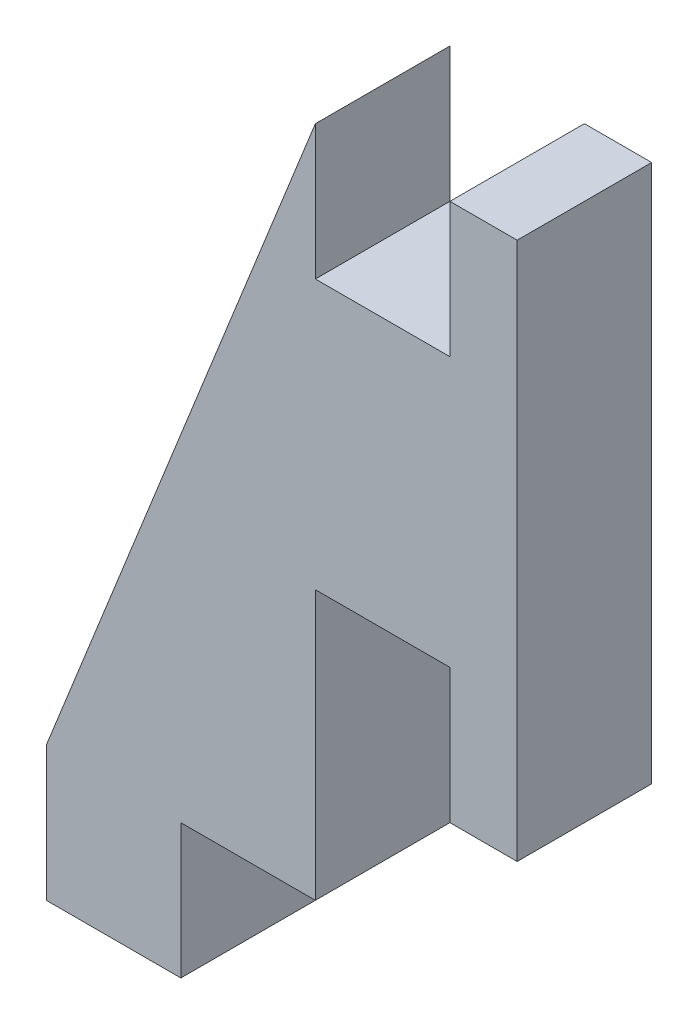
ISO-10303-21;
HEADER;
FILE_DESCRIPTION(('STEP AP214'),'2;1');
FILE_NAME('part.step','',(''),(''),'','','');
FILE_SCHEMA(('AUTOMOTIVE_DESIGN { 1 0 10303 214 1 1 1 1 }'));
ENDSEC;
DATA;
#1=APPLICATION_CONTEXT('core data for automotive mechanical design processes');
#2=APPLICATION_PROTOCOL_DEFINITION('international standard','automotive_design',2000,#1);
#3=PRODUCT_CONTEXT('',#1,'mechanical');
#4=PRODUCT('Part','Part','',(#3));
#5=PRODUCT_RELATED_PRODUCT_CATEGORY('part','',(#4));
#6=PRODUCT_DEFINITION_FORMATION('','',#4);
#7=PRODUCT_DEFINITION_CONTEXT('part definition',#1,'design');
#8=PRODUCT_DEFINITION('design','',#6,#7);
#9=PRODUCT_DEFINITION_SHAPE('','',#8);
#10=(LENGTH_UNIT() NAMED_UNIT(*) SI_UNIT(.MILLI.,.METRE.));
#11=(NAMED_UNIT(*) PLANE_ANGLE_UNIT() SI_UNIT($,.RADIAN.));
#12=(NAMED_UNIT(*) SI_UNIT($,.STERADIAN.) SOLID_ANGLE_UNIT());
#13=UNCERTAINTY_MEASURE_WITH_UNIT(LENGTH_MEASURE(1.E-05),#10,'distance_accuracy_value','');
#14=(GEOMETRIC_REPRESENTATION_CONTEXT(3) GLOBAL_UNCERTAINTY_ASSIGNED_CONTEXT((#13)) GLOBAL_UNIT_ASSIGNED_CONTEXT((#10,
#11,#12)) REPRESENTATION_CONTEXT('',''));
#15=CARTESIAN_POINT('',(0.,0.,0.));
#16=DIRECTION('',(0.,0.,1.));
#17=DIRECTION('',(1.,0.,0.));
#18=AXIS2_PLACEMENT_3D('',#15,#16,#17);
#19=CARTESIAN_POINT('',(0.,25.4,6.35));
#20=DIRECTION('',(-1.,0.,0.));
#21=DIRECTION('',(0.,0.,1.));
#22=AXIS2_PLACEMENT_3D('',#19,#20,#21);
#23=PLANE('',#22);
#24=DIRECTION('',(0.,1.,0.));
#25=VECTOR('',#24,1.);
#26=CARTESIAN_POINT('',(0.,25.4,0.));
#27=LINE('',#26,#25);
#28=CARTESIAN_POINT('',(0.,25.4,0.));
#29=VERTEX_POINT('',#28);
#30=CARTESIAN_POINT('',(0.,31.75,0.));
#31=VERTEX_POINT('',#30);
#32=EDGE_CURVE('E177',#29,#31,#27,.T.);
#33=ORIENTED_EDGE('',*,*,#32,.T.);
#34=DIRECTION('',(0.,0.,-1.));
#35=VECTOR('',#34,1.);
#36=CARTESIAN_POINT('',(0.,31.75,6.35));
#37=LINE('',#36,#35);
#38=CARTESIAN_POINT('',(0.,31.75,6.35));
#39=VERTEX_POINT('',#38);
#40=EDGE_CURVE('E11',#39,#31,#37,.T.);
#41=ORIENTED_EDGE('',*,*,#40,.F.);
#42=DIRECTION('',(0.,1.,0.));
#43=VECTOR('',#42,1.);
#44=CARTESIAN_POINT('',(0.,25.4,6.35));
#45=LINE('',#44,#43);
#46=CARTESIAN_POINT('',(0.,25.4,6.35));
#47=VERTEX_POINT('',#46);
#48=EDGE_CURVE('E178',#47,#39,#45,.T.);
#49=ORIENTED_EDGE('',*,*,#48,.F.);
#50=DIRECTION('',(0.,0.,-1.));
#51=VECTOR('',#50,1.);
#52=CARTESIAN_POINT('',(0.,25.4,6.35));
#53=LINE('',#52,#51);
#54=EDGE_CURVE('E191',#47,#29,#53,.T.);
#55=ORIENTED_EDGE('',*,*,#54,.T.);
#56=EDGE_LOOP('',(#33,#41,#49,#55));
#57=FACE_BOUND('',#56,.T.);
#58=ADVANCED_FACE('F33',(#57),#23,.F.);
#59=CARTESIAN_POINT('',(-12.7,0.,6.35));
#60=DIRECTION('',(0.928476690885259,-0.371390676354104,0.));
#61=DIRECTION('',(0.371390676354104,0.928476690885259,0.));
#62=AXIS2_PLACEMENT_3D('',#59,#60,#61);
#63=PLANE('',#62);
#64=DIRECTION('',(-0.371390676354104,-0.928476690885259,0.));
#65=VECTOR('',#64,1.);
#66=CARTESIAN_POINT('',(-12.7,0.,0.));
#67=LINE('',#66,#65);
#68=CARTESIAN_POINT('',(-12.7,0.,0.));
#69=VERTEX_POINT('',#68);
#70=EDGE_CURVE('E194',#31,#69,#67,.T.);
#71=ORIENTED_EDGE('',*,*,#70,.T.);
#72=DIRECTION('',(0.,0.,-1.));
#73=VECTOR('',#72,1.);
#74=CARTESIAN_POINT('',(-12.7,0.,6.35));
#75=LINE('',#74,#73);
#76=CARTESIAN_POINT('',(-12.7,0.,6.35));
#77=VERTEX_POINT('',#76);
#78=EDGE_CURVE('E41',#77,#69,#75,.T.);
#79=ORIENTED_EDGE('',*,*,#78,.F.);
#80=DIRECTION('',(-0.371390676354104,-0.928476690885259,0.));
#81=VECTOR('',#80,1.);
#82=CARTESIAN_POINT('',(-12.7,0.,6.35));
#83=LINE('',#82,#81);
#84=EDGE_CURVE('E92',#39,#77,#83,.T.);
#85=ORIENTED_EDGE('',*,*,#84,.F.);
#86=ORIENTED_EDGE('',*,*,#40,.T.);
#87=EDGE_LOOP('',(#71,#79,#85,#86));
#88=FACE_BOUND('',#87,.T.);
#89=ADVANCED_FACE('F247',(#88),#63,.F.);
#90=CARTESIAN_POINT('',(-12.7,-6.35,6.35));
#91=DIRECTION('',(1.,0.,0.));
#92=DIRECTION('',(0.,0.,-1.));
#93=AXIS2_PLACEMENT_3D('',#90,#91,#92);
#94=PLANE('',#93);
#95=DIRECTION('',(0.,-1.,0.));
#96=VECTOR('',#95,1.);
#97=CARTESIAN_POINT('',(-12.7,-6.35,0.));
#98=LINE('',#97,#96);
#99=CARTESIAN_POINT('',(-12.7,-6.35,0.));
#100=VERTEX_POINT('',#99);
#101=EDGE_CURVE('E196',#69,#100,#98,.T.);
#102=ORIENTED_EDGE('',*,*,#101,.T.);
#103=DIRECTION('',(0.,0.,-1.));
#104=VECTOR('',#103,1.);
#105=CARTESIAN_POINT('',(-12.7,-6.35,6.35));
#106=LINE('',#105,#104);
#107=CARTESIAN_POINT('',(-12.7,-6.35,6.35));
#108=VERTEX_POINT('',#107);
#109=EDGE_CURVE('E220',#108,#100,#106,.T.);
#110=ORIENTED_EDGE('',*,*,#109,.F.);
#111=DIRECTION('',(0.,-1.,0.));
#112=VECTOR('',#111,1.);
#113=CARTESIAN_POINT('',(-12.7,-6.35,6.35));
#114=LINE('',#113,#112);
#115=EDGE_CURVE('E181',#77,#108,#114,.T.);
#116=ORIENTED_EDGE('',*,*,#115,.F.);
#117=ORIENTED_EDGE('',*,*,#78,.T.);
#118=EDGE_LOOP('',(#102,#110,#116,#117));
#119=FACE_BOUND('',#118,.T.);
#120=ADVANCED_FACE('F226',(#119),#94,.F.);
#121=CARTESIAN_POINT('',(-6.35,-6.35,6.35));
#122=DIRECTION('',(0.,1.,0.));
#123=DIRECTION('',(-1.,0.,0.));
#124=AXIS2_PLACEMENT_3D('',#121,#122,#123);
#125=PLANE('',#124);
#126=DIRECTION('',(1.,0.,0.));
#127=VECTOR('',#126,1.);
#128=CARTESIAN_POINT('',(-6.35,-6.35,0.));
#129=LINE('',#128,#127);
#130=CARTESIAN_POINT('',(-6.35,-6.35,0.));
#131=VERTEX_POINT('',#130);
#132=EDGE_CURVE('E198',#100,#131,#129,.T.);
#133=ORIENTED_EDGE('',*,*,#132,.T.);
#134=DIRECTION('',(0.,0.,-1.));
#135=VECTOR('',#134,1.);
#136=CARTESIAN_POINT('',(-6.35,-6.35,6.35));
#137=LINE('',#136,#135);
#138=CARTESIAN_POINT('',(-6.35,-6.35,6.35));
#139=VERTEX_POINT('',#138);
#140=EDGE_CURVE('E217',#139,#131,#137,.T.);
#141=ORIENTED_EDGE('',*,*,#140,.F.);
#142=DIRECTION('',(1.,0.,0.));
#143=VECTOR('',#142,1.);
#144=CARTESIAN_POINT('',(-6.35,-6.35,6.35));
#145=LINE('',#144,#143);
#146=EDGE_CURVE('E183',#108,#139,#145,.T.);
#147=ORIENTED_EDGE('',*,*,#146,.F.);
#148=ORIENTED_EDGE('',*,*,#109,.T.);
#149=EDGE_LOOP('',(#133,#141,#147,#148));
#150=FACE_BOUND('',#149,.T.);
#151=ADVANCED_FACE('F236',(#150),#125,.F.);
#152=CARTESIAN_POINT('',(-6.35,0.,6.35));
#153=DIRECTION('',(-1.,0.,0.));
#154=DIRECTION('',(0.,0.,1.));
#155=AXIS2_PLACEMENT_3D('',#152,#153,#154);
#156=PLANE('',#155);
#157=DIRECTION('',(0.,1.,0.));
#158=VECTOR('',#157,1.);
#159=CARTESIAN_POINT('',(-6.35,0.,0.));
#160=LINE('',#159,#158);
#161=CARTESIAN_POINT('',(-6.35,0.,0.));
#162=VERTEX_POINT('',#161);
#163=EDGE_CURVE('E200',#131,#162,#160,.T.);
#164=ORIENTED_EDGE('',*,*,#163,.T.);
#165=DIRECTION('',(0.,0.,-1.));
#166=VECTOR('',#165,1.);
#167=CARTESIAN_POINT('',(-6.35,0.,6.35));
#168=LINE('',#167,#166);
#169=CARTESIAN_POINT('',(-6.35,0.,6.35));
#170=VERTEX_POINT('',#169);
#171=EDGE_CURVE('E214',#170,#162,#168,.T.);
#172=ORIENTED_EDGE('',*,*,#171,.F.);
#173=DIRECTION('',(0.,1.,0.));
#174=VECTOR('',#173,1.);
#175=CARTESIAN_POINT('',(-6.35,0.,6.35));
#176=LINE('',#175,#174);
#177=EDGE_CURVE('E185',#139,#170,#176,.T.);
#178=ORIENTED_EDGE('',*,*,#177,.F.);
#179=ORIENTED_EDGE('',*,*,#140,.T.);
#180=EDGE_LOOP('',(#164,#172,#178,#179));
#181=FACE_BOUND('',#180,.T.);
#182=ADVANCED_FACE('F240',(#181),#156,.F.);
#183=CARTESIAN_POINT('',(0.,0.,6.35));
#184=DIRECTION('',(0.,1.,0.));
#185=DIRECTION('',(-1.,0.,0.));
#186=AXIS2_PLACEMENT_3D('',#183,#184,#185);
#187=PLANE('',#186);
#188=DIRECTION('',(1.,0.,0.));
#189=VECTOR('',#188,1.);
#190=CARTESIAN_POINT('',(0.,0.,0.));
#191=LINE('',#190,#189);
#192=CARTESIAN_POINT('',(0.,0.,0.));
#193=VERTEX_POINT('',#192);
#194=EDGE_CURVE('E202',#162,#193,#191,.T.);
#195=ORIENTED_EDGE('',*,*,#194,.T.);
#196=DIRECTION('',(0.,0.,-1.));
#197=VECTOR('',#196,1.);
#198=CARTESIAN_POINT('',(0.,0.,6.35));
#199=LINE('',#198,#197);
#200=CARTESIAN_POINT('',(0.,0.,6.35));
#201=VERTEX_POINT('',#200);
#202=EDGE_CURVE('E211',#201,#193,#199,.T.);
#203=ORIENTED_EDGE('',*,*,#202,.F.);
#204=DIRECTION('',(1.,0.,0.));
#205=VECTOR('',#204,1.);
#206=CARTESIAN_POINT('',(0.,0.,6.35));
#207=LINE('',#206,#205);
#208=EDGE_CURVE('E187',#170,#201,#207,.T.);
#209=ORIENTED_EDGE('',*,*,#208,.F.);
#210=ORIENTED_EDGE('',*,*,#171,.T.);
#211=EDGE_LOOP('',(#195,#203,#209,#210));
#212=FACE_BOUND('',#211,.T.);
#213=ADVANCED_FACE('F259',(#212),#187,.F.);
#214=CARTESIAN_POINT('',(0.,0.,6.35));
#215=DIRECTION('',(-1.,0.,0.));
#216=DIRECTION('',(0.,0.,1.));
#217=AXIS2_PLACEMENT_3D('',#214,#215,#216);
#218=PLANE('',#217);
#219=DIRECTION('',(0.,1.,0.));
#220=VECTOR('',#219,1.);
#221=CARTESIAN_POINT('',(0.,0.,0.));
#222=LINE('',#221,#220);
#223=CARTESIAN_POINT('',(0.,12.7,0.));
#224=VERTEX_POINT('',#223);
#225=EDGE_CURVE('E204',#193,#224,#222,.T.);
#226=ORIENTED_EDGE('',*,*,#225,.T.);
#227=DIRECTION('',(0.,0.,-1.));
#228=VECTOR('',#227,1.);
#229=CARTESIAN_POINT('',(0.,12.7,6.35));
#230=LINE('',#229,#228);
#231=CARTESIAN_POINT('',(0.,12.7,6.35));
#232=VERTEX_POINT('',#231);
#233=EDGE_CURVE('E137',#232,#224,#230,.T.);
#234=ORIENTED_EDGE('',*,*,#233,.F.);
#235=DIRECTION('',(0.,1.,0.));
#236=VECTOR('',#235,1.);
#237=CARTESIAN_POINT('',(0.,0.,6.35));
#238=LINE('',#237,#236);
#239=EDGE_CURVE('E123',#201,#232,#238,.T.);
#240=ORIENTED_EDGE('',*,*,#239,.F.);
#241=ORIENTED_EDGE('',*,*,#202,.T.);
#242=EDGE_LOOP('',(#226,#234,#240,#241));
#243=FACE_BOUND('',#242,.T.);
#244=ADVANCED_FACE('F262',(#243),#218,.F.);
#245=CARTESIAN_POINT('',(0.,12.7,6.35));
#246=DIRECTION('',(0.,1.,0.));
#247=DIRECTION('',(0.,0.,1.));
#248=AXIS2_PLACEMENT_3D('',#245,#246,#247);
#249=PLANE('',#248);
#250=DIRECTION('',(1.,0.,0.));
#251=VECTOR('',#250,1.);
#252=CARTESIAN_POINT('',(0.,12.7,0.));
#253=LINE('',#252,#251);
#254=CARTESIAN_POINT('',(6.35,12.7,0.));
#255=VERTEX_POINT('',#254);
#256=EDGE_CURVE('E133',#224,#255,#253,.T.);
#257=ORIENTED_EDGE('',*,*,#256,.T.);
#258=DIRECTION('',(0.,0.,-1.));
#259=VECTOR('',#258,1.);
#260=CARTESIAN_POINT('',(6.35,12.7,6.35));
#261=LINE('',#260,#259);
#262=CARTESIAN_POINT('',(6.35,12.7,6.35));
#263=VERTEX_POINT('',#262);
#264=EDGE_CURVE('E130',#263,#255,#261,.T.);
#265=ORIENTED_EDGE('',*,*,#264,.F.);
#266=DIRECTION('',(1.,0.,0.));
#267=VECTOR('',#266,1.);
#268=CARTESIAN_POINT('',(0.,12.7,6.35));
#269=LINE('',#268,#267);
#270=EDGE_CURVE('E114',#232,#263,#269,.T.);
#271=ORIENTED_EDGE('',*,*,#270,.F.);
#272=ORIENTED_EDGE('',*,*,#233,.T.);
#273=EDGE_LOOP('',(#257,#265,#271,#272));
#274=FACE_BOUND('',#273,.T.);
#275=ADVANCED_FACE('F131',(#274),#249,.F.);
#276=CARTESIAN_POINT('',(6.35,25.4,6.35));
#277=DIRECTION('',(0.,-1.,0.));
#278=DIRECTION('',(0.,0.,-1.));
#279=AXIS2_PLACEMENT_3D('',#276,#277,#278);
#280=PLANE('',#279);
#281=DIRECTION('',(-1.,0.,0.));
#282=VECTOR('',#281,1.);
#283=CARTESIAN_POINT('',(6.35,25.4,0.));
#284=LINE('',#283,#282);
#285=CARTESIAN_POINT('',(6.35,25.4,0.));
#286=VERTEX_POINT('',#285);
#287=EDGE_CURVE('E84',#286,#29,#284,.T.);
#288=ORIENTED_EDGE('',*,*,#287,.T.);
#289=ORIENTED_EDGE('',*,*,#54,.F.);
#290=DIRECTION('',(-1.,0.,0.));
#291=VECTOR('',#290,1.);
#292=CARTESIAN_POINT('',(6.35,25.4,6.35));
#293=LINE('',#292,#291);
#294=CARTESIAN_POINT('',(6.35,25.4,6.35));
#295=VERTEX_POINT('',#294);
#296=EDGE_CURVE('E49',#295,#47,#293,.T.);
#297=ORIENTED_EDGE('',*,*,#296,.F.);
#298=DIRECTION('',(0.,0.,-1.));
#299=VECTOR('',#298,1.);
#300=CARTESIAN_POINT('',(6.35,25.4,6.35));
#301=LINE('',#300,#299);
#302=EDGE_CURVE('E81',#295,#286,#301,.T.);
#303=ORIENTED_EDGE('',*,*,#302,.T.);
#304=EDGE_LOOP('',(#288,#289,#297,#303));
#305=FACE_BOUND('',#304,.T.);
#306=ADVANCED_FACE('F269',(#305),#280,.F.);
#307=CARTESIAN_POINT('',(0.,0.,6.35));
#308=DIRECTION('',(0.,0.,1.));
#309=DIRECTION('',(1.,0.,0.));
#310=AXIS2_PLACEMENT_3D('',#307,#308,#309);
#311=PLANE('',#310);
#312=ORIENTED_EDGE('',*,*,#48,.T.);
#313=ORIENTED_EDGE('',*,*,#84,.T.);
#314=ORIENTED_EDGE('',*,*,#115,.T.);
#315=ORIENTED_EDGE('',*,*,#146,.T.);
#316=ORIENTED_EDGE('',*,*,#177,.T.);
#317=ORIENTED_EDGE('',*,*,#208,.T.);
#318=ORIENTED_EDGE('',*,*,#239,.T.);
#319=ORIENTED_EDGE('',*,*,#270,.T.);
#320=DIRECTION('',(0.,-1.,0.));
#321=VECTOR('',#320,1.);
#322=CARTESIAN_POINT('',(6.35,6.35,6.35));
#323=LINE('',#322,#321);
#324=CARTESIAN_POINT('',(6.35,6.35,6.35));
#325=VERTEX_POINT('',#324);
#326=EDGE_CURVE('E120',#263,#325,#323,.T.);
#327=ORIENTED_EDGE('',*,*,#326,.T.);
#328=DIRECTION('',(1.,0.,0.));
#329=VECTOR('',#328,1.);
#330=CARTESIAN_POINT('',(9.525,6.35,6.35));
#331=LINE('',#330,#329);
#332=CARTESIAN_POINT('',(9.525,6.35,6.35));
#333=VERTEX_POINT('',#332);
#334=EDGE_CURVE('E146',#325,#333,#331,.T.);
#335=ORIENTED_EDGE('',*,*,#334,.T.);
#336=DIRECTION('',(0.,1.,0.));
#337=VECTOR('',#336,1.);
#338=CARTESIAN_POINT('',(9.525,6.35,6.35));
#339=LINE('',#338,#337);
#340=CARTESIAN_POINT('',(9.525,31.75,6.35));
#341=VERTEX_POINT('',#340);
#342=EDGE_CURVE('E152',#333,#341,#339,.T.);
#343=ORIENTED_EDGE('',*,*,#342,.T.);
#344=DIRECTION('',(-1.,0.,0.));
#345=VECTOR('',#344,1.);
#346=CARTESIAN_POINT('',(9.525,31.75,6.35));
#347=LINE('',#346,#345);
#348=CARTESIAN_POINT('',(6.35,31.75,6.35));
#349=VERTEX_POINT('',#348);
#350=EDGE_CURVE('E155',#341,#349,#347,.T.);
#351=ORIENTED_EDGE('',*,*,#350,.T.);
#352=EDGE_CURVE('E143',#349,#295,#323,.T.);
#353=ORIENTED_EDGE('',*,*,#352,.T.);
#354=ORIENTED_EDGE('',*,*,#296,.T.);
#355=EDGE_LOOP('',(#312,#313,#314,#315,#316,#317,#318,#319,#327,#335,#343,#351,#353,#354));
#356=FACE_BOUND('',#355,.T.);
#357=ADVANCED_FACE('F116',(#356),#311,.T.);
#358=CARTESIAN_POINT('',(0.,0.,0.));
#359=DIRECTION('',(0.,0.,1.));
#360=DIRECTION('',(1.,0.,0.));
#361=AXIS2_PLACEMENT_3D('',#358,#359,#360);
#362=PLANE('',#361);
#363=ORIENTED_EDGE('',*,*,#32,.F.);
#364=ORIENTED_EDGE('',*,*,#287,.F.);
#365=DIRECTION('',(0.,-1.,0.));
#366=VECTOR('',#365,1.);
#367=CARTESIAN_POINT('',(6.35,6.35,0.));
#368=LINE('',#367,#366);
#369=CARTESIAN_POINT('',(6.35,31.75,0.));
#370=VERTEX_POINT('',#369);
#371=EDGE_CURVE('E159',#370,#286,#368,.T.);
#372=ORIENTED_EDGE('',*,*,#371,.F.);
#373=DIRECTION('',(-1.,0.,0.));
#374=VECTOR('',#373,1.);
#375=CARTESIAN_POINT('',(9.525,31.75,0.));
#376=LINE('',#375,#374);
#377=CARTESIAN_POINT('',(9.525,31.75,0.));
#378=VERTEX_POINT('',#377);
#379=EDGE_CURVE('E144',#378,#370,#376,.T.);
#380=ORIENTED_EDGE('',*,*,#379,.F.);
#381=DIRECTION('',(0.,1.,0.));
#382=VECTOR('',#381,1.);
#383=CARTESIAN_POINT('',(9.525,6.35,0.));
#384=LINE('',#383,#382);
#385=CARTESIAN_POINT('',(9.525,6.35,0.));
#386=VERTEX_POINT('',#385);
#387=EDGE_CURVE('E148',#386,#378,#384,.T.);
#388=ORIENTED_EDGE('',*,*,#387,.F.);
#389=DIRECTION('',(1.,0.,0.));
#390=VECTOR('',#389,1.);
#391=CARTESIAN_POINT('',(9.525,6.35,0.));
#392=LINE('',#391,#390);
#393=CARTESIAN_POINT('',(6.35,6.35,0.));
#394=VERTEX_POINT('',#393);
#395=EDGE_CURVE('E162',#394,#386,#392,.T.);
#396=ORIENTED_EDGE('',*,*,#395,.F.);
#397=EDGE_CURVE('E163',#255,#394,#368,.T.);
#398=ORIENTED_EDGE('',*,*,#397,.F.);
#399=ORIENTED_EDGE('',*,*,#256,.F.);
#400=ORIENTED_EDGE('',*,*,#225,.F.);
#401=ORIENTED_EDGE('',*,*,#194,.F.);
#402=ORIENTED_EDGE('',*,*,#163,.F.);
#403=ORIENTED_EDGE('',*,*,#132,.F.);
#404=ORIENTED_EDGE('',*,*,#101,.F.);
#405=ORIENTED_EDGE('',*,*,#70,.F.);
#406=EDGE_LOOP('',(#363,#364,#372,#380,#388,#396,#398,#399,#400,#401,#402,#403,#404,#405));
#407=FACE_BOUND('',#406,.T.);
#408=ADVANCED_FACE('F231',(#407),#362,.F.);
#409=CARTESIAN_POINT('',(6.35,6.35,6.35));
#410=DIRECTION('',(1.,0.,0.));
#411=DIRECTION('',(0.,1.,0.));
#412=AXIS2_PLACEMENT_3D('',#409,#410,#411);
#413=PLANE('',#412);
#414=ORIENTED_EDGE('',*,*,#326,.F.);
#415=ORIENTED_EDGE('',*,*,#264,.T.);
#416=ORIENTED_EDGE('',*,*,#397,.T.);
#417=DIRECTION('',(0.,0.,-1.));
#418=VECTOR('',#417,1.);
#419=CARTESIAN_POINT('',(6.35,6.35,6.35));
#420=LINE('',#419,#418);
#421=EDGE_CURVE('E142',#325,#394,#420,.T.);
#422=ORIENTED_EDGE('',*,*,#421,.F.);
#423=EDGE_LOOP('',(#414,#415,#416,#422));
#424=FACE_BOUND('',#423,.T.);
#425=ADVANCED_FACE('F140',(#424),#413,.F.);
#426=ORIENTED_EDGE('',*,*,#302,.F.);
#427=ORIENTED_EDGE('',*,*,#352,.F.);
#428=DIRECTION('',(0.,0.,-1.));
#429=VECTOR('',#428,1.);
#430=CARTESIAN_POINT('',(6.35,31.75,6.35));
#431=LINE('',#430,#429);
#432=EDGE_CURVE('E158',#349,#370,#431,.T.);
#433=ORIENTED_EDGE('',*,*,#432,.T.);
#434=ORIENTED_EDGE('',*,*,#371,.T.);
#435=EDGE_LOOP('',(#426,#427,#433,#434));
#436=FACE_BOUND('',#435,.T.);
#437=ADVANCED_FACE('F276',(#436),#413,.F.);
#438=CARTESIAN_POINT('',(9.525,6.35,6.35));
#439=DIRECTION('',(0.,1.,0.));
#440=DIRECTION('',(0.,0.,1.));
#441=AXIS2_PLACEMENT_3D('',#438,#439,#440);
#442=PLANE('',#441);
#443=ORIENTED_EDGE('',*,*,#395,.T.);
#444=DIRECTION('',(0.,0.,-1.));
#445=VECTOR('',#444,1.);
#446=CARTESIAN_POINT('',(9.525,6.35,6.35));
#447=LINE('',#446,#445);
#448=EDGE_CURVE('E173',#333,#386,#447,.T.);
#449=ORIENTED_EDGE('',*,*,#448,.F.);
#450=ORIENTED_EDGE('',*,*,#334,.F.);
#451=ORIENTED_EDGE('',*,*,#421,.T.);
#452=EDGE_LOOP('',(#443,#449,#450,#451));
#453=FACE_BOUND('',#452,.T.);
#454=ADVANCED_FACE('F279',(#453),#442,.F.);
#455=CARTESIAN_POINT('',(9.525,6.35,6.35));
#456=DIRECTION('',(-1.,0.,0.));
#457=DIRECTION('',(0.,0.,1.));
#458=AXIS2_PLACEMENT_3D('',#455,#456,#457);
#459=PLANE('',#458);
#460=ORIENTED_EDGE('',*,*,#387,.T.);
#461=DIRECTION('',(0.,0.,-1.));
#462=VECTOR('',#461,1.);
#463=CARTESIAN_POINT('',(9.525,31.75,6.35));
#464=LINE('',#463,#462);
#465=EDGE_CURVE('E170',#341,#378,#464,.T.);
#466=ORIENTED_EDGE('',*,*,#465,.F.);
#467=ORIENTED_EDGE('',*,*,#342,.F.);
#468=ORIENTED_EDGE('',*,*,#448,.T.);
#469=EDGE_LOOP('',(#460,#466,#467,#468));
#470=FACE_BOUND('',#469,.T.);
#471=ADVANCED_FACE('F283',(#470),#459,.F.);
#472=CARTESIAN_POINT('',(9.525,31.75,6.35));
#473=DIRECTION('',(0.,-1.,0.));
#474=DIRECTION('',(0.,0.,-1.));
#475=AXIS2_PLACEMENT_3D('',#472,#473,#474);
#476=PLANE('',#475);
#477=ORIENTED_EDGE('',*,*,#379,.T.);
#478=ORIENTED_EDGE('',*,*,#432,.F.);
#479=ORIENTED_EDGE('',*,*,#350,.F.);
#480=ORIENTED_EDGE('',*,*,#465,.T.);
#481=EDGE_LOOP('',(#477,#478,#479,#480));
#482=FACE_BOUND('',#481,.T.);
#483=ADVANCED_FACE('F287',(#482),#476,.F.);
#484=CLOSED_SHELL('',(#58,#89,#120,#151,#182,#213,#244,#275,#306,#357,#408,#425,#437,#454,#471,#483));
#485=MANIFOLD_SOLID_BREP('B2',#484);
#486=ADVANCED_BREP_SHAPE_REPRESENTATION('',(#18,#485),#14);
#487=SHAPE_DEFINITION_REPRESENTATION(#9,#486);
ENDSEC;
END-ISO-10303-21;
